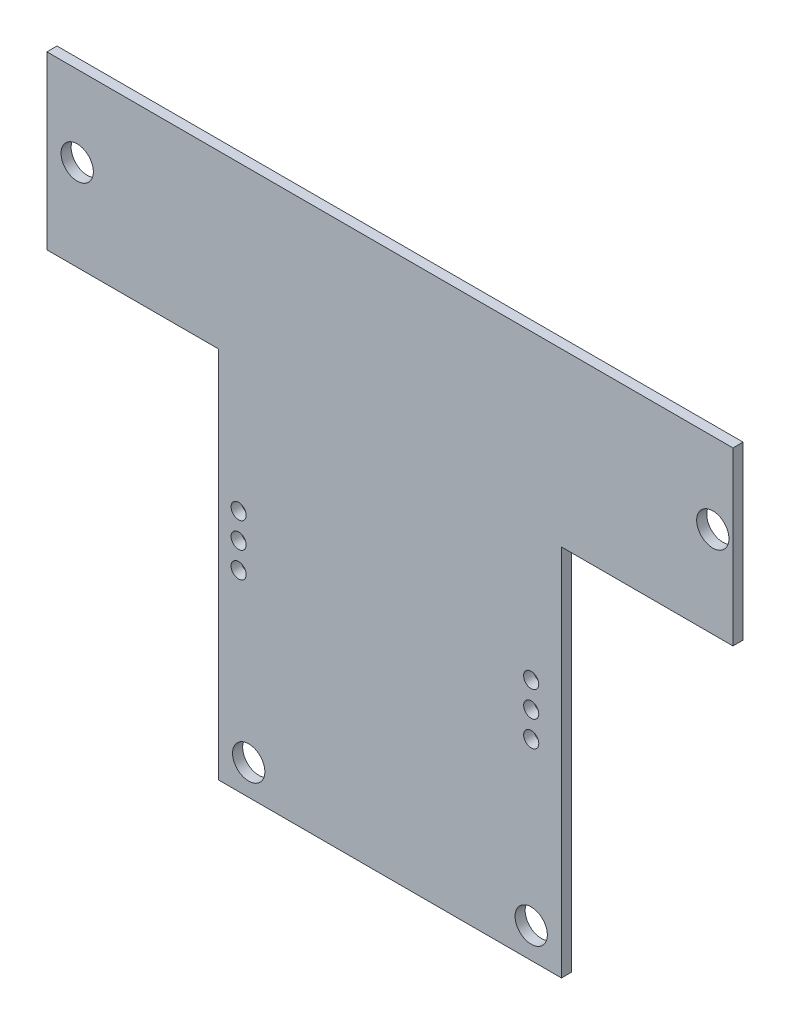
ISO-10303-21;
HEADER;
FILE_DESCRIPTION(('STEP AP214'),'2;1');
FILE_NAME('part.step','',(''),(''),'','','');
FILE_SCHEMA(('AUTOMOTIVE_DESIGN { 1 0 10303 214 1 1 1 1 }'));
ENDSEC;
DATA;
#1=APPLICATION_CONTEXT('core data for automotive mechanical design processes');
#2=APPLICATION_PROTOCOL_DEFINITION('international standard','automotive_design',2000,#1);
#3=PRODUCT_CONTEXT('',#1,'mechanical');
#4=PRODUCT('Part','Part','',(#3));
#5=PRODUCT_RELATED_PRODUCT_CATEGORY('part','',(#4));
#6=PRODUCT_DEFINITION_FORMATION('','',#4);
#7=PRODUCT_DEFINITION_CONTEXT('part definition',#1,'design');
#8=PRODUCT_DEFINITION('design','',#6,#7);
#9=PRODUCT_DEFINITION_SHAPE('','',#8);
#10=(LENGTH_UNIT() NAMED_UNIT(*) SI_UNIT(.MILLI.,.METRE.));
#11=(NAMED_UNIT(*) PLANE_ANGLE_UNIT() SI_UNIT($,.RADIAN.));
#12=(NAMED_UNIT(*) SI_UNIT($,.STERADIAN.) SOLID_ANGLE_UNIT());
#13=UNCERTAINTY_MEASURE_WITH_UNIT(LENGTH_MEASURE(1.E-05),#10,'distance_accuracy_value','');
#14=(GEOMETRIC_REPRESENTATION_CONTEXT(3) GLOBAL_UNCERTAINTY_ASSIGNED_CONTEXT((#13)) GLOBAL_UNIT_ASSIGNED_CONTEXT((#10,
#11,#12)) REPRESENTATION_CONTEXT('',''));
#15=CARTESIAN_POINT('',(0.,0.,0.));
#16=DIRECTION('',(0.,0.,1.));
#17=DIRECTION('',(1.,0.,0.));
#18=AXIS2_PLACEMENT_3D('',#15,#16,#17);
#19=CARTESIAN_POINT('',(0.,0.,1.));
#20=DIRECTION('',(0.,0.,-1.));
#21=DIRECTION('',(-1.,0.,0.));
#22=AXIS2_PLACEMENT_3D('',#19,#20,#21);
#23=PLANE('',#22);
#24=CARTESIAN_POINT('',(19.,-32.46,1.));
#25=DIRECTION('',(0.,0.,1.));
#26=DIRECTION('',(1.,0.,0.));
#27=AXIS2_PLACEMENT_3D('',#24,#25,#26);
#28=CIRCLE('',#27,0.750000000000002);
#29=CARTESIAN_POINT('',(19.75,-32.46,1.));
#30=VERTEX_POINT('',#29);
#31=EDGE_CURVE('E169',#30,#30,#28,.T.);
#32=ORIENTED_EDGE('',*,*,#31,.F.);
#33=EDGE_LOOP('',(#32));
#34=FACE_BOUND('',#33,.T.);
#35=CARTESIAN_POINT('',(19.,-29.92,1.));
#36=DIRECTION('',(0.,0.,1.));
#37=DIRECTION('',(1.,0.,0.));
#38=AXIS2_PLACEMENT_3D('',#35,#36,#37);
#39=CIRCLE('',#38,0.750000000000002);
#40=CARTESIAN_POINT('',(19.75,-29.92,1.));
#41=VERTEX_POINT('',#40);
#42=EDGE_CURVE('E293',#41,#41,#39,.T.);
#43=ORIENTED_EDGE('',*,*,#42,.F.);
#44=EDGE_LOOP('',(#43));
#45=FACE_BOUND('',#44,.T.);
#46=CARTESIAN_POINT('',(48.,-29.92,1.));
#47=DIRECTION('',(0.,0.,1.));
#48=DIRECTION('',(1.,0.,0.));
#49=AXIS2_PLACEMENT_3D('',#46,#47,#48);
#50=CIRCLE('',#49,0.749999999999999);
#51=CARTESIAN_POINT('',(48.75,-29.92,1.));
#52=VERTEX_POINT('',#51);
#53=EDGE_CURVE('E296',#52,#52,#50,.T.);
#54=ORIENTED_EDGE('',*,*,#53,.F.);
#55=EDGE_LOOP('',(#54));
#56=FACE_BOUND('',#55,.T.);
#57=CARTESIAN_POINT('',(48.,-32.46,1.));
#58=DIRECTION('',(0.,0.,1.));
#59=DIRECTION('',(1.,0.,0.));
#60=AXIS2_PLACEMENT_3D('',#57,#58,#59);
#61=CIRCLE('',#60,0.749999999999999);
#62=CARTESIAN_POINT('',(48.75,-32.46,1.));
#63=VERTEX_POINT('',#62);
#64=EDGE_CURVE('E300',#63,#63,#61,.T.);
#65=ORIENTED_EDGE('',*,*,#64,.F.);
#66=EDGE_LOOP('',(#65));
#67=FACE_BOUND('',#66,.T.);
#68=CARTESIAN_POINT('',(48.,-35.,1.));
#69=DIRECTION('',(0.,0.,1.));
#70=DIRECTION('',(1.,0.,0.));
#71=AXIS2_PLACEMENT_3D('',#68,#69,#70);
#72=CIRCLE('',#71,0.749999999999999);
#73=CARTESIAN_POINT('',(48.75,-35.,1.));
#74=VERTEX_POINT('',#73);
#75=EDGE_CURVE('E187',#74,#74,#72,.T.);
#76=ORIENTED_EDGE('',*,*,#75,.F.);
#77=EDGE_LOOP('',(#76));
#78=FACE_BOUND('',#77,.T.);
#79=CARTESIAN_POINT('',(19.,-35.,1.));
#80=DIRECTION('',(0.,0.,1.));
#81=DIRECTION('',(1.,0.,0.));
#82=AXIS2_PLACEMENT_3D('',#79,#80,#81);
#83=CIRCLE('',#82,0.750000000000002);
#84=CARTESIAN_POINT('',(19.75,-35.,1.));
#85=VERTEX_POINT('',#84);
#86=EDGE_CURVE('E164',#85,#85,#83,.T.);
#87=ORIENTED_EDGE('',*,*,#86,.F.);
#88=EDGE_LOOP('',(#87));
#89=FACE_BOUND('',#88,.T.);
#90=DIRECTION('',(0.,-1.,0.));
#91=VECTOR('',#90,1.);
#92=CARTESIAN_POINT('',(0.,-17.,1.));
#93=LINE('',#92,#91);
#94=CARTESIAN_POINT('',(0.,0.,1.));
#95=VERTEX_POINT('',#94);
#96=CARTESIAN_POINT('',(0.,-17.,1.));
#97=VERTEX_POINT('',#96);
#98=EDGE_CURVE('E148',#95,#97,#93,.T.);
#99=ORIENTED_EDGE('',*,*,#98,.T.);
#100=DIRECTION('',(1.,0.,0.));
#101=VECTOR('',#100,1.);
#102=CARTESIAN_POINT('',(17.,-17.,1.));
#103=LINE('',#102,#101);
#104=CARTESIAN_POINT('',(17.,-17.,1.));
#105=VERTEX_POINT('',#104);
#106=EDGE_CURVE('E96',#97,#105,#103,.T.);
#107=ORIENTED_EDGE('',*,*,#106,.T.);
#108=DIRECTION('',(0.,-1.,0.));
#109=VECTOR('',#108,1.);
#110=CARTESIAN_POINT('',(17.,-54.,1.));
#111=LINE('',#110,#109);
#112=CARTESIAN_POINT('',(17.,-54.,1.));
#113=VERTEX_POINT('',#112);
#114=EDGE_CURVE('E213',#105,#113,#111,.T.);
#115=ORIENTED_EDGE('',*,*,#114,.T.);
#116=DIRECTION('',(1.,0.,0.));
#117=VECTOR('',#116,1.);
#118=CARTESIAN_POINT('',(51.,-54.,1.));
#119=LINE('',#118,#117);
#120=CARTESIAN_POINT('',(51.,-54.,1.));
#121=VERTEX_POINT('',#120);
#122=EDGE_CURVE('E215',#113,#121,#119,.T.);
#123=ORIENTED_EDGE('',*,*,#122,.T.);
#124=DIRECTION('',(0.,1.,0.));
#125=VECTOR('',#124,1.);
#126=CARTESIAN_POINT('',(51.,-17.,1.));
#127=LINE('',#126,#125);
#128=CARTESIAN_POINT('',(51.,-17.,1.));
#129=VERTEX_POINT('',#128);
#130=EDGE_CURVE('E115',#121,#129,#127,.T.);
#131=ORIENTED_EDGE('',*,*,#130,.T.);
#132=DIRECTION('',(1.,0.,0.));
#133=VECTOR('',#132,1.);
#134=CARTESIAN_POINT('',(68.,-17.,1.));
#135=LINE('',#134,#133);
#136=CARTESIAN_POINT('',(68.,-17.,1.));
#137=VERTEX_POINT('',#136);
#138=EDGE_CURVE('E109',#129,#137,#135,.T.);
#139=ORIENTED_EDGE('',*,*,#138,.T.);
#140=DIRECTION('',(0.,1.,0.));
#141=VECTOR('',#140,1.);
#142=CARTESIAN_POINT('',(68.,0.,1.));
#143=LINE('',#142,#141);
#144=CARTESIAN_POINT('',(68.,0.,1.));
#145=VERTEX_POINT('',#144);
#146=EDGE_CURVE('E113',#137,#145,#143,.T.);
#147=ORIENTED_EDGE('',*,*,#146,.T.);
#148=DIRECTION('',(-1.,0.,0.));
#149=VECTOR('',#148,1.);
#150=CARTESIAN_POINT('',(0.,0.,1.));
#151=LINE('',#150,#149);
#152=EDGE_CURVE('E53',#145,#95,#151,.T.);
#153=ORIENTED_EDGE('',*,*,#152,.T.);
#154=EDGE_LOOP('',(#99,#107,#115,#123,#131,#139,#147,#153));
#155=FACE_BOUND('',#154,.T.);
#156=CARTESIAN_POINT('',(3.,-8.,1.));
#157=DIRECTION('',(0.,0.,1.));
#158=DIRECTION('',(1.,0.,0.));
#159=AXIS2_PLACEMENT_3D('',#156,#157,#158);
#160=CIRCLE('',#159,1.6);
#161=CARTESIAN_POINT('',(4.6,-8.,1.));
#162=VERTEX_POINT('',#161);
#163=EDGE_CURVE('E137',#162,#162,#160,.T.);
#164=ORIENTED_EDGE('',*,*,#163,.F.);
#165=EDGE_LOOP('',(#164));
#166=FACE_BOUND('',#165,.T.);
#167=CARTESIAN_POINT('',(66.,-8.,1.));
#168=DIRECTION('',(0.,0.,1.));
#169=DIRECTION('',(1.,0.,0.));
#170=AXIS2_PLACEMENT_3D('',#167,#168,#169);
#171=CIRCLE('',#170,1.60000000000001);
#172=CARTESIAN_POINT('',(67.6,-8.,1.));
#173=VERTEX_POINT('',#172);
#174=EDGE_CURVE('E201',#173,#173,#171,.T.);
#175=ORIENTED_EDGE('',*,*,#174,.F.);
#176=EDGE_LOOP('',(#175));
#177=FACE_BOUND('',#176,.T.);
#178=CARTESIAN_POINT('',(20.,-51.,1.));
#179=DIRECTION('',(0.,0.,1.));
#180=DIRECTION('',(1.,0.,0.));
#181=AXIS2_PLACEMENT_3D('',#178,#179,#180);
#182=CIRCLE('',#181,1.6);
#183=CARTESIAN_POINT('',(21.6,-51.,1.));
#184=VERTEX_POINT('',#183);
#185=EDGE_CURVE('E195',#184,#184,#182,.T.);
#186=ORIENTED_EDGE('',*,*,#185,.F.);
#187=EDGE_LOOP('',(#186));
#188=FACE_BOUND('',#187,.T.);
#189=CARTESIAN_POINT('',(48.,-51.,1.));
#190=DIRECTION('',(0.,0.,1.));
#191=DIRECTION('',(1.,0.,0.));
#192=AXIS2_PLACEMENT_3D('',#189,#190,#191);
#193=CIRCLE('',#192,1.6);
#194=CARTESIAN_POINT('',(49.6,-51.,1.));
#195=VERTEX_POINT('',#194);
#196=EDGE_CURVE('E189',#195,#195,#193,.T.);
#197=ORIENTED_EDGE('',*,*,#196,.F.);
#198=EDGE_LOOP('',(#197));
#199=FACE_BOUND('',#198,.T.);
#200=ADVANCED_FACE('F34',(#34,#45,#56,#67,#78,#89,#155,#166,#177,#188,#199),#23,.F.);
#201=CARTESIAN_POINT('',(0.,0.,0.));
#202=DIRECTION('',(0.,0.,-1.));
#203=DIRECTION('',(-1.,0.,0.));
#204=AXIS2_PLACEMENT_3D('',#201,#202,#203);
#205=PLANE('',#204);
#206=CARTESIAN_POINT('',(19.,-32.46,0.));
#207=DIRECTION('',(0.,0.,-1.));
#208=DIRECTION('',(-1.,0.,0.));
#209=AXIS2_PLACEMENT_3D('',#206,#207,#208);
#210=CIRCLE('',#209,0.750000000000002);
#211=CARTESIAN_POINT('',(18.25,-32.46,0.));
#212=VERTEX_POINT('',#211);
#213=EDGE_CURVE('E38',#212,#212,#210,.T.);
#214=ORIENTED_EDGE('',*,*,#213,.F.);
#215=EDGE_LOOP('',(#214));
#216=FACE_BOUND('',#215,.T.);
#217=CARTESIAN_POINT('',(19.,-29.92,0.));
#218=DIRECTION('',(0.,0.,-1.));
#219=DIRECTION('',(-1.,0.,0.));
#220=AXIS2_PLACEMENT_3D('',#217,#218,#219);
#221=CIRCLE('',#220,0.750000000000002);
#222=CARTESIAN_POINT('',(18.25,-29.92,0.));
#223=VERTEX_POINT('',#222);
#224=EDGE_CURVE('E174',#223,#223,#221,.T.);
#225=ORIENTED_EDGE('',*,*,#224,.F.);
#226=EDGE_LOOP('',(#225));
#227=FACE_BOUND('',#226,.T.);
#228=CARTESIAN_POINT('',(48.,-29.92,0.));
#229=DIRECTION('',(0.,0.,-1.));
#230=DIRECTION('',(-1.,0.,0.));
#231=AXIS2_PLACEMENT_3D('',#228,#229,#230);
#232=CIRCLE('',#231,0.749999999999999);
#233=CARTESIAN_POINT('',(47.25,-29.92,0.));
#234=VERTEX_POINT('',#233);
#235=EDGE_CURVE('E172',#234,#234,#232,.T.);
#236=ORIENTED_EDGE('',*,*,#235,.F.);
#237=EDGE_LOOP('',(#236));
#238=FACE_BOUND('',#237,.T.);
#239=CARTESIAN_POINT('',(48.,-32.46,0.));
#240=DIRECTION('',(0.,0.,-1.));
#241=DIRECTION('',(-1.,0.,0.));
#242=AXIS2_PLACEMENT_3D('',#239,#240,#241);
#243=CIRCLE('',#242,0.749999999999999);
#244=CARTESIAN_POINT('',(47.25,-32.46,0.));
#245=VERTEX_POINT('',#244);
#246=EDGE_CURVE('E168',#245,#245,#243,.T.);
#247=ORIENTED_EDGE('',*,*,#246,.F.);
#248=EDGE_LOOP('',(#247));
#249=FACE_BOUND('',#248,.T.);
#250=CARTESIAN_POINT('',(48.,-35.,0.));
#251=DIRECTION('',(0.,0.,-1.));
#252=DIRECTION('',(-1.,0.,0.));
#253=AXIS2_PLACEMENT_3D('',#250,#251,#252);
#254=CIRCLE('',#253,0.749999999999999);
#255=CARTESIAN_POINT('',(47.25,-35.,0.));
#256=VERTEX_POINT('',#255);
#257=EDGE_CURVE('E165',#256,#256,#254,.T.);
#258=ORIENTED_EDGE('',*,*,#257,.F.);
#259=EDGE_LOOP('',(#258));
#260=FACE_BOUND('',#259,.T.);
#261=CARTESIAN_POINT('',(19.,-35.,0.));
#262=DIRECTION('',(0.,0.,-1.));
#263=DIRECTION('',(-1.,0.,0.));
#264=AXIS2_PLACEMENT_3D('',#261,#262,#263);
#265=CIRCLE('',#264,0.750000000000002);
#266=CARTESIAN_POINT('',(18.25,-35.,0.));
#267=VERTEX_POINT('',#266);
#268=EDGE_CURVE('E160',#267,#267,#265,.T.);
#269=ORIENTED_EDGE('',*,*,#268,.F.);
#270=EDGE_LOOP('',(#269));
#271=FACE_BOUND('',#270,.T.);
#272=CARTESIAN_POINT('',(20.,-51.,0.));
#273=DIRECTION('',(0.,0.,1.));
#274=DIRECTION('',(1.,0.,0.));
#275=AXIS2_PLACEMENT_3D('',#272,#273,#274);
#276=CIRCLE('',#275,1.6);
#277=CARTESIAN_POINT('',(21.6,-51.,0.));
#278=VERTEX_POINT('',#277);
#279=EDGE_CURVE('E192',#278,#278,#276,.T.);
#280=ORIENTED_EDGE('',*,*,#279,.T.);
#281=EDGE_LOOP('',(#280));
#282=FACE_BOUND('',#281,.T.);
#283=CARTESIAN_POINT('',(3.,-8.,0.));
#284=DIRECTION('',(0.,0.,1.));
#285=DIRECTION('',(1.,0.,0.));
#286=AXIS2_PLACEMENT_3D('',#283,#284,#285);
#287=CIRCLE('',#286,1.6);
#288=CARTESIAN_POINT('',(4.6,-8.,0.));
#289=VERTEX_POINT('',#288);
#290=EDGE_CURVE('E204',#289,#289,#287,.T.);
#291=ORIENTED_EDGE('',*,*,#290,.T.);
#292=EDGE_LOOP('',(#291));
#293=FACE_BOUND('',#292,.T.);
#294=DIRECTION('',(0.,-1.,0.));
#295=VECTOR('',#294,1.);
#296=CARTESIAN_POINT('',(0.,-17.,0.));
#297=LINE('',#296,#295);
#298=CARTESIAN_POINT('',(0.,0.,0.));
#299=VERTEX_POINT('',#298);
#300=CARTESIAN_POINT('',(0.,-17.,0.));
#301=VERTEX_POINT('',#300);
#302=EDGE_CURVE('E133',#299,#301,#297,.T.);
#303=ORIENTED_EDGE('',*,*,#302,.F.);
#304=DIRECTION('',(-1.,0.,0.));
#305=VECTOR('',#304,1.);
#306=CARTESIAN_POINT('',(0.,0.,0.));
#307=LINE('',#306,#305);
#308=CARTESIAN_POINT('',(68.,0.,0.));
#309=VERTEX_POINT('',#308);
#310=EDGE_CURVE('E88',#309,#299,#307,.T.);
#311=ORIENTED_EDGE('',*,*,#310,.F.);
#312=DIRECTION('',(0.,1.,0.));
#313=VECTOR('',#312,1.);
#314=CARTESIAN_POINT('',(68.,0.,0.));
#315=LINE('',#314,#313);
#316=CARTESIAN_POINT('',(68.,-17.,0.));
#317=VERTEX_POINT('',#316);
#318=EDGE_CURVE('E82',#317,#309,#315,.T.);
#319=ORIENTED_EDGE('',*,*,#318,.F.);
#320=DIRECTION('',(1.,0.,0.));
#321=VECTOR('',#320,1.);
#322=CARTESIAN_POINT('',(68.,-17.,0.));
#323=LINE('',#322,#321);
#324=CARTESIAN_POINT('',(51.,-17.,0.));
#325=VERTEX_POINT('',#324);
#326=EDGE_CURVE('E123',#325,#317,#323,.T.);
#327=ORIENTED_EDGE('',*,*,#326,.F.);
#328=DIRECTION('',(0.,1.,0.));
#329=VECTOR('',#328,1.);
#330=CARTESIAN_POINT('',(51.,-17.,0.));
#331=LINE('',#330,#329);
#332=CARTESIAN_POINT('',(51.,-54.,0.));
#333=VERTEX_POINT('',#332);
#334=EDGE_CURVE('E143',#333,#325,#331,.T.);
#335=ORIENTED_EDGE('',*,*,#334,.F.);
#336=DIRECTION('',(1.,0.,0.));
#337=VECTOR('',#336,1.);
#338=CARTESIAN_POINT('',(51.,-54.,0.));
#339=LINE('',#338,#337);
#340=CARTESIAN_POINT('',(17.,-54.,0.));
#341=VERTEX_POINT('',#340);
#342=EDGE_CURVE('E141',#341,#333,#339,.T.);
#343=ORIENTED_EDGE('',*,*,#342,.F.);
#344=DIRECTION('',(0.,-1.,0.));
#345=VECTOR('',#344,1.);
#346=CARTESIAN_POINT('',(17.,-54.,0.));
#347=LINE('',#346,#345);
#348=CARTESIAN_POINT('',(17.,-17.,0.));
#349=VERTEX_POINT('',#348);
#350=EDGE_CURVE('E139',#349,#341,#347,.T.);
#351=ORIENTED_EDGE('',*,*,#350,.F.);
#352=DIRECTION('',(1.,0.,0.));
#353=VECTOR('',#352,1.);
#354=CARTESIAN_POINT('',(17.,-17.,0.));
#355=LINE('',#354,#353);
#356=EDGE_CURVE('E136',#301,#349,#355,.T.);
#357=ORIENTED_EDGE('',*,*,#356,.F.);
#358=EDGE_LOOP('',(#303,#311,#319,#327,#335,#343,#351,#357));
#359=FACE_BOUND('',#358,.T.);
#360=CARTESIAN_POINT('',(66.,-8.,0.));
#361=DIRECTION('',(0.,0.,1.));
#362=DIRECTION('',(1.,0.,0.));
#363=AXIS2_PLACEMENT_3D('',#360,#361,#362);
#364=CIRCLE('',#363,1.60000000000001);
#365=CARTESIAN_POINT('',(67.6,-8.,0.));
#366=VERTEX_POINT('',#365);
#367=EDGE_CURVE('E198',#366,#366,#364,.T.);
#368=ORIENTED_EDGE('',*,*,#367,.T.);
#369=EDGE_LOOP('',(#368));
#370=FACE_BOUND('',#369,.T.);
#371=CARTESIAN_POINT('',(48.,-51.,0.));
#372=DIRECTION('',(0.,0.,1.));
#373=DIRECTION('',(1.,0.,0.));
#374=AXIS2_PLACEMENT_3D('',#371,#372,#373);
#375=CIRCLE('',#374,1.6);
#376=CARTESIAN_POINT('',(49.6,-51.,0.));
#377=VERTEX_POINT('',#376);
#378=EDGE_CURVE('E163',#377,#377,#375,.T.);
#379=ORIENTED_EDGE('',*,*,#378,.T.);
#380=EDGE_LOOP('',(#379));
#381=FACE_BOUND('',#380,.T.);
#382=ADVANCED_FACE('F228',(#216,#227,#238,#249,#260,#271,#282,#293,#359,#370,#381),#205,.T.);
#383=CARTESIAN_POINT('',(0.,-17.,1.));
#384=DIRECTION('',(1.,0.,0.));
#385=DIRECTION('',(0.,0.,-1.));
#386=AXIS2_PLACEMENT_3D('',#383,#384,#385);
#387=PLANE('',#386);
#388=ORIENTED_EDGE('',*,*,#302,.T.);
#389=DIRECTION('',(0.,0.,-1.));
#390=VECTOR('',#389,1.);
#391=CARTESIAN_POINT('',(0.,-17.,1.));
#392=LINE('',#391,#390);
#393=EDGE_CURVE('E11',#97,#301,#392,.T.);
#394=ORIENTED_EDGE('',*,*,#393,.F.);
#395=ORIENTED_EDGE('',*,*,#98,.F.);
#396=DIRECTION('',(0.,0.,-1.));
#397=VECTOR('',#396,1.);
#398=CARTESIAN_POINT('',(0.,0.,1.));
#399=LINE('',#398,#397);
#400=EDGE_CURVE('E129',#95,#299,#399,.T.);
#401=ORIENTED_EDGE('',*,*,#400,.T.);
#402=EDGE_LOOP('',(#388,#394,#395,#401));
#403=FACE_BOUND('',#402,.T.);
#404=ADVANCED_FACE('F36',(#403),#387,.F.);
#405=CARTESIAN_POINT('',(17.,-17.,1.));
#406=DIRECTION('',(0.,1.,0.));
#407=DIRECTION('',(0.,0.,1.));
#408=AXIS2_PLACEMENT_3D('',#405,#406,#407);
#409=PLANE('',#408);
#410=ORIENTED_EDGE('',*,*,#356,.T.);
#411=DIRECTION('',(0.,0.,-1.));
#412=VECTOR('',#411,1.);
#413=CARTESIAN_POINT('',(17.,-17.,1.));
#414=LINE('',#413,#412);
#415=EDGE_CURVE('E44',#105,#349,#414,.T.);
#416=ORIENTED_EDGE('',*,*,#415,.F.);
#417=ORIENTED_EDGE('',*,*,#106,.F.);
#418=ORIENTED_EDGE('',*,*,#393,.T.);
#419=EDGE_LOOP('',(#410,#416,#417,#418));
#420=FACE_BOUND('',#419,.T.);
#421=ADVANCED_FACE('F396',(#420),#409,.F.);
#422=CARTESIAN_POINT('',(17.,-54.,1.));
#423=DIRECTION('',(1.,0.,0.));
#424=DIRECTION('',(0.,0.,-1.));
#425=AXIS2_PLACEMENT_3D('',#422,#423,#424);
#426=PLANE('',#425);
#427=ORIENTED_EDGE('',*,*,#350,.T.);
#428=DIRECTION('',(0.,0.,-1.));
#429=VECTOR('',#428,1.);
#430=CARTESIAN_POINT('',(17.,-54.,1.));
#431=LINE('',#430,#429);
#432=EDGE_CURVE('E155',#113,#341,#431,.T.);
#433=ORIENTED_EDGE('',*,*,#432,.F.);
#434=ORIENTED_EDGE('',*,*,#114,.F.);
#435=ORIENTED_EDGE('',*,*,#415,.T.);
#436=EDGE_LOOP('',(#427,#433,#434,#435));
#437=FACE_BOUND('',#436,.T.);
#438=ADVANCED_FACE('F387',(#437),#426,.F.);
#439=CARTESIAN_POINT('',(51.,-54.,1.));
#440=DIRECTION('',(0.,1.,0.));
#441=DIRECTION('',(-1.,0.,0.));
#442=AXIS2_PLACEMENT_3D('',#439,#440,#441);
#443=PLANE('',#442);
#444=ORIENTED_EDGE('',*,*,#342,.T.);
#445=DIRECTION('',(0.,0.,-1.));
#446=VECTOR('',#445,1.);
#447=CARTESIAN_POINT('',(51.,-54.,1.));
#448=LINE('',#447,#446);
#449=EDGE_CURVE('E152',#121,#333,#448,.T.);
#450=ORIENTED_EDGE('',*,*,#449,.F.);
#451=ORIENTED_EDGE('',*,*,#122,.F.);
#452=ORIENTED_EDGE('',*,*,#432,.T.);
#453=EDGE_LOOP('',(#444,#450,#451,#452));
#454=FACE_BOUND('',#453,.T.);
#455=ADVANCED_FACE('F221',(#454),#443,.F.);
#456=CARTESIAN_POINT('',(51.,-17.,1.));
#457=DIRECTION('',(-1.,0.,0.));
#458=DIRECTION('',(0.,-1.,0.));
#459=AXIS2_PLACEMENT_3D('',#456,#457,#458);
#460=PLANE('',#459);
#461=ORIENTED_EDGE('',*,*,#334,.T.);
#462=DIRECTION('',(0.,0.,-1.));
#463=VECTOR('',#462,1.);
#464=CARTESIAN_POINT('',(51.,-17.,1.));
#465=LINE('',#464,#463);
#466=EDGE_CURVE('E124',#129,#325,#465,.T.);
#467=ORIENTED_EDGE('',*,*,#466,.F.);
#468=ORIENTED_EDGE('',*,*,#130,.F.);
#469=ORIENTED_EDGE('',*,*,#449,.T.);
#470=EDGE_LOOP('',(#461,#467,#468,#469));
#471=FACE_BOUND('',#470,.T.);
#472=ADVANCED_FACE('F225',(#471),#460,.F.);
#473=CARTESIAN_POINT('',(68.,-17.,1.));
#474=DIRECTION('',(0.,1.,0.));
#475=DIRECTION('',(-1.,0.,0.));
#476=AXIS2_PLACEMENT_3D('',#473,#474,#475);
#477=PLANE('',#476);
#478=ORIENTED_EDGE('',*,*,#326,.T.);
#479=DIRECTION('',(0.,0.,-1.));
#480=VECTOR('',#479,1.);
#481=CARTESIAN_POINT('',(68.,-17.,1.));
#482=LINE('',#481,#480);
#483=EDGE_CURVE('E120',#137,#317,#482,.T.);
#484=ORIENTED_EDGE('',*,*,#483,.F.);
#485=ORIENTED_EDGE('',*,*,#138,.F.);
#486=ORIENTED_EDGE('',*,*,#466,.T.);
#487=EDGE_LOOP('',(#478,#484,#485,#486));
#488=FACE_BOUND('',#487,.T.);
#489=ADVANCED_FACE('F121',(#488),#477,.F.);
#490=CARTESIAN_POINT('',(68.,0.,1.));
#491=DIRECTION('',(-1.,0.,0.));
#492=DIRECTION('',(0.,0.,1.));
#493=AXIS2_PLACEMENT_3D('',#490,#491,#492);
#494=PLANE('',#493);
#495=ORIENTED_EDGE('',*,*,#318,.T.);
#496=DIRECTION('',(0.,0.,-1.));
#497=VECTOR('',#496,1.);
#498=CARTESIAN_POINT('',(68.,0.,1.));
#499=LINE('',#498,#497);
#500=EDGE_CURVE('E125',#145,#309,#499,.T.);
#501=ORIENTED_EDGE('',*,*,#500,.F.);
#502=ORIENTED_EDGE('',*,*,#146,.F.);
#503=ORIENTED_EDGE('',*,*,#483,.T.);
#504=EDGE_LOOP('',(#495,#501,#502,#503));
#505=FACE_BOUND('',#504,.T.);
#506=ADVANCED_FACE('F127',(#505),#494,.F.);
#507=CARTESIAN_POINT('',(0.,0.,1.));
#508=DIRECTION('',(0.,-1.,0.));
#509=DIRECTION('',(0.,0.,-1.));
#510=AXIS2_PLACEMENT_3D('',#507,#508,#509);
#511=PLANE('',#510);
#512=ORIENTED_EDGE('',*,*,#310,.T.);
#513=ORIENTED_EDGE('',*,*,#400,.F.);
#514=ORIENTED_EDGE('',*,*,#152,.F.);
#515=ORIENTED_EDGE('',*,*,#500,.T.);
#516=EDGE_LOOP('',(#512,#513,#514,#515));
#517=FACE_BOUND('',#516,.T.);
#518=ADVANCED_FACE('F234',(#517),#511,.F.);
#519=CARTESIAN_POINT('',(3.,-8.,1.));
#520=DIRECTION('',(0.,0.,-1.));
#521=DIRECTION('',(-1.,0.,0.));
#522=AXIS2_PLACEMENT_3D('',#519,#520,#521);
#523=CYLINDRICAL_SURFACE('',#522,1.6);
#524=ORIENTED_EDGE('',*,*,#163,.T.);
#525=EDGE_LOOP('',(#524));
#526=FACE_BOUND('',#525,.T.);
#527=ORIENTED_EDGE('',*,*,#290,.F.);
#528=EDGE_LOOP('',(#527));
#529=FACE_BOUND('',#528,.T.);
#530=ADVANCED_FACE('F236',(#526,#529),#523,.F.);
#531=CARTESIAN_POINT('',(66.,-8.,1.));
#532=DIRECTION('',(0.,0.,-1.));
#533=DIRECTION('',(-1.,0.,0.));
#534=AXIS2_PLACEMENT_3D('',#531,#532,#533);
#535=CYLINDRICAL_SURFACE('',#534,1.60000000000001);
#536=ORIENTED_EDGE('',*,*,#174,.T.);
#537=EDGE_LOOP('',(#536));
#538=FACE_BOUND('',#537,.T.);
#539=ORIENTED_EDGE('',*,*,#367,.F.);
#540=EDGE_LOOP('',(#539));
#541=FACE_BOUND('',#540,.T.);
#542=ADVANCED_FACE('F242',(#538,#541),#535,.F.);
#543=CARTESIAN_POINT('',(20.,-51.,1.));
#544=DIRECTION('',(0.,0.,-1.));
#545=DIRECTION('',(-1.,0.,0.));
#546=AXIS2_PLACEMENT_3D('',#543,#544,#545);
#547=CYLINDRICAL_SURFACE('',#546,1.6);
#548=ORIENTED_EDGE('',*,*,#185,.T.);
#549=EDGE_LOOP('',(#548));
#550=FACE_BOUND('',#549,.T.);
#551=ORIENTED_EDGE('',*,*,#279,.F.);
#552=EDGE_LOOP('',(#551));
#553=FACE_BOUND('',#552,.T.);
#554=ADVANCED_FACE('F259',(#550,#553),#547,.F.);
#555=CARTESIAN_POINT('',(48.,-51.,1.));
#556=DIRECTION('',(0.,0.,-1.));
#557=DIRECTION('',(-1.,0.,0.));
#558=AXIS2_PLACEMENT_3D('',#555,#556,#557);
#559=CYLINDRICAL_SURFACE('',#558,1.6);
#560=ORIENTED_EDGE('',*,*,#196,.T.);
#561=EDGE_LOOP('',(#560));
#562=FACE_BOUND('',#561,.T.);
#563=ORIENTED_EDGE('',*,*,#378,.F.);
#564=EDGE_LOOP('',(#563));
#565=FACE_BOUND('',#564,.T.);
#566=ADVANCED_FACE('F263',(#562,#565),#559,.F.);
#567=CARTESIAN_POINT('',(19.,-35.,-9.));
#568=DIRECTION('',(0.,0.,1.));
#569=DIRECTION('',(1.,0.,0.));
#570=AXIS2_PLACEMENT_3D('',#567,#568,#569);
#571=CYLINDRICAL_SURFACE('',#570,0.750000000000002);
#572=ORIENTED_EDGE('',*,*,#268,.T.);
#573=EDGE_LOOP('',(#572));
#574=FACE_BOUND('',#573,.T.);
#575=ORIENTED_EDGE('',*,*,#86,.T.);
#576=EDGE_LOOP('',(#575));
#577=FACE_BOUND('',#576,.T.);
#578=ADVANCED_FACE('F267',(#574,#577),#571,.F.);
#579=CARTESIAN_POINT('',(48.,-35.,-9.));
#580=DIRECTION('',(0.,0.,1.));
#581=DIRECTION('',(1.,0.,0.));
#582=AXIS2_PLACEMENT_3D('',#579,#580,#581);
#583=CYLINDRICAL_SURFACE('',#582,0.749999999999999);
#584=ORIENTED_EDGE('',*,*,#257,.T.);
#585=EDGE_LOOP('',(#584));
#586=FACE_BOUND('',#585,.T.);
#587=ORIENTED_EDGE('',*,*,#75,.T.);
#588=EDGE_LOOP('',(#587));
#589=FACE_BOUND('',#588,.T.);
#590=ADVANCED_FACE('F271',(#586,#589),#583,.F.);
#591=CARTESIAN_POINT('',(48.,-32.46,-9.));
#592=DIRECTION('',(0.,0.,1.));
#593=DIRECTION('',(1.,0.,0.));
#594=AXIS2_PLACEMENT_3D('',#591,#592,#593);
#595=CYLINDRICAL_SURFACE('',#594,0.749999999999999);
#596=ORIENTED_EDGE('',*,*,#246,.T.);
#597=EDGE_LOOP('',(#596));
#598=FACE_BOUND('',#597,.T.);
#599=ORIENTED_EDGE('',*,*,#64,.T.);
#600=EDGE_LOOP('',(#599));
#601=FACE_BOUND('',#600,.T.);
#602=ADVANCED_FACE('F275',(#598,#601),#595,.F.);
#603=CARTESIAN_POINT('',(48.,-29.92,-9.));
#604=DIRECTION('',(0.,0.,1.));
#605=DIRECTION('',(1.,0.,0.));
#606=AXIS2_PLACEMENT_3D('',#603,#604,#605);
#607=CYLINDRICAL_SURFACE('',#606,0.749999999999999);
#608=ORIENTED_EDGE('',*,*,#235,.T.);
#609=EDGE_LOOP('',(#608));
#610=FACE_BOUND('',#609,.T.);
#611=ORIENTED_EDGE('',*,*,#53,.T.);
#612=EDGE_LOOP('',(#611));
#613=FACE_BOUND('',#612,.T.);
#614=ADVANCED_FACE('F279',(#610,#613),#607,.F.);
#615=CARTESIAN_POINT('',(19.,-29.92,-9.));
#616=DIRECTION('',(0.,0.,1.));
#617=DIRECTION('',(1.,0.,0.));
#618=AXIS2_PLACEMENT_3D('',#615,#616,#617);
#619=CYLINDRICAL_SURFACE('',#618,0.750000000000002);
#620=ORIENTED_EDGE('',*,*,#224,.T.);
#621=EDGE_LOOP('',(#620));
#622=FACE_BOUND('',#621,.T.);
#623=ORIENTED_EDGE('',*,*,#42,.T.);
#624=EDGE_LOOP('',(#623));
#625=FACE_BOUND('',#624,.T.);
#626=ADVANCED_FACE('F283',(#622,#625),#619,.F.);
#627=CARTESIAN_POINT('',(19.,-32.46,-9.));
#628=DIRECTION('',(0.,0.,1.));
#629=DIRECTION('',(1.,0.,0.));
#630=AXIS2_PLACEMENT_3D('',#627,#628,#629);
#631=CYLINDRICAL_SURFACE('',#630,0.750000000000002);
#632=ORIENTED_EDGE('',*,*,#213,.T.);
#633=EDGE_LOOP('',(#632));
#634=FACE_BOUND('',#633,.T.);
#635=ORIENTED_EDGE('',*,*,#31,.T.);
#636=EDGE_LOOP('',(#635));
#637=FACE_BOUND('',#636,.T.);
#638=ADVANCED_FACE('F287',(#634,#637),#631,.F.);
#639=CLOSED_SHELL('',(#200,#382,#404,#421,#438,#455,#472,#489,#506,#518,#530,#542,#554,#566,
#578,#590,#602,#614,#626,#638));
#640=MANIFOLD_SOLID_BREP('B2',#639);
#641=ADVANCED_BREP_SHAPE_REPRESENTATION('',(#18,#640),#14);
#642=SHAPE_DEFINITION_REPRESENTATION(#9,#641);
ENDSEC;
END-ISO-10303-21;
